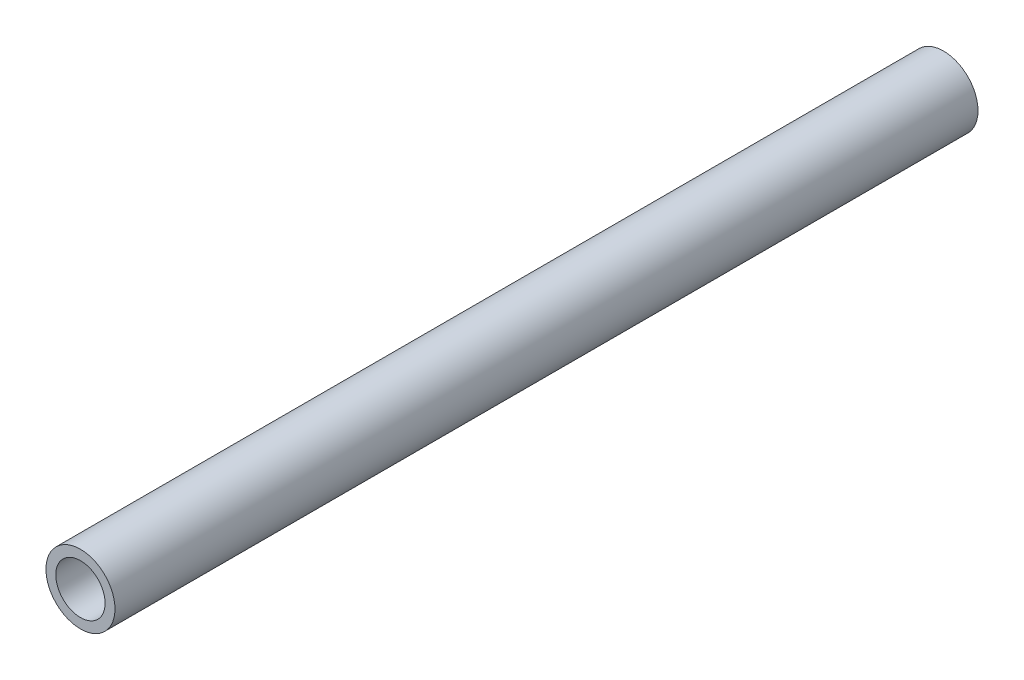
ISO-10303-21;
HEADER;
FILE_DESCRIPTION(('STEP AP214'),'2;1');
FILE_NAME('part.step','',(''),(''),'','','');
FILE_SCHEMA(('AUTOMOTIVE_DESIGN { 1 0 10303 214 1 1 1 1 }'));
ENDSEC;
DATA;
#1=APPLICATION_CONTEXT('core data for automotive mechanical design processes');
#2=APPLICATION_PROTOCOL_DEFINITION('international standard','automotive_design',2000,#1);
#3=PRODUCT_CONTEXT('',#1,'mechanical');
#4=PRODUCT('Part','Part','',(#3));
#5=PRODUCT_RELATED_PRODUCT_CATEGORY('part','',(#4));
#6=PRODUCT_DEFINITION_FORMATION('','',#4);
#7=PRODUCT_DEFINITION_CONTEXT('part definition',#1,'design');
#8=PRODUCT_DEFINITION('design','',#6,#7);
#9=PRODUCT_DEFINITION_SHAPE('','',#8);
#10=(LENGTH_UNIT() NAMED_UNIT(*) SI_UNIT(.MILLI.,.METRE.));
#11=(NAMED_UNIT(*) PLANE_ANGLE_UNIT() SI_UNIT($,.RADIAN.));
#12=(NAMED_UNIT(*) SI_UNIT($,.STERADIAN.) SOLID_ANGLE_UNIT());
#13=UNCERTAINTY_MEASURE_WITH_UNIT(LENGTH_MEASURE(1.E-05),#10,'distance_accuracy_value','');
#14=(GEOMETRIC_REPRESENTATION_CONTEXT(3) GLOBAL_UNCERTAINTY_ASSIGNED_CONTEXT((#13)) GLOBAL_UNIT_ASSIGNED_CONTEXT((#10,
#11,#12)) REPRESENTATION_CONTEXT('',''));
#15=CARTESIAN_POINT('',(0.,0.,0.));
#16=DIRECTION('',(0.,0.,1.));
#17=DIRECTION('',(1.,0.,0.));
#18=AXIS2_PLACEMENT_3D('',#15,#16,#17);
#19=CARTESIAN_POINT('',(0.,0.,175.));
#20=DIRECTION('',(0.,0.,1.));
#21=DIRECTION('',(1.,0.,0.));
#22=AXIS2_PLACEMENT_3D('',#19,#20,#21);
#23=PLANE('',#22);
#24=CARTESIAN_POINT('',(0.,0.,175.));
#25=DIRECTION('',(0.,0.,1.));
#26=DIRECTION('',(1.,0.,0.));
#27=AXIS2_PLACEMENT_3D('',#24,#25,#26);
#28=CIRCLE('',#27,7.);
#29=CARTESIAN_POINT('',(7.,0.,175.));
#30=VERTEX_POINT('',#29);
#31=EDGE_CURVE('E10',#30,#30,#28,.T.);
#32=ORIENTED_EDGE('',*,*,#31,.T.);
#33=EDGE_LOOP('',(#32));
#34=FACE_BOUND('',#33,.T.);
#35=CARTESIAN_POINT('',(0.,0.,175.));
#36=DIRECTION('',(0.,0.,1.));
#37=DIRECTION('',(1.,0.,0.));
#38=AXIS2_PLACEMENT_3D('',#35,#36,#37);
#39=CIRCLE('',#38,5.);
#40=CARTESIAN_POINT('',(5.,0.,175.));
#41=VERTEX_POINT('',#40);
#42=EDGE_CURVE('E49',#41,#41,#39,.T.);
#43=ORIENTED_EDGE('',*,*,#42,.F.);
#44=EDGE_LOOP('',(#43));
#45=FACE_BOUND('',#44,.T.);
#46=ADVANCED_FACE('F38',(#34,#45),#23,.T.);
#47=CARTESIAN_POINT('',(0.,0.,0.));
#48=DIRECTION('',(0.,0.,1.));
#49=DIRECTION('',(1.,0.,0.));
#50=AXIS2_PLACEMENT_3D('',#47,#48,#49);
#51=PLANE('',#50);
#52=CARTESIAN_POINT('',(0.,0.,0.));
#53=DIRECTION('',(0.,0.,1.));
#54=DIRECTION('',(1.,0.,0.));
#55=AXIS2_PLACEMENT_3D('',#52,#53,#54);
#56=CIRCLE('',#55,7.);
#57=CARTESIAN_POINT('',(7.,0.,0.));
#58=VERTEX_POINT('',#57);
#59=EDGE_CURVE('E42',#58,#58,#56,.T.);
#60=ORIENTED_EDGE('',*,*,#59,.F.);
#61=EDGE_LOOP('',(#60));
#62=FACE_BOUND('',#61,.T.);
#63=CARTESIAN_POINT('',(0.,0.,0.));
#64=DIRECTION('',(0.,0.,1.));
#65=DIRECTION('',(1.,0.,0.));
#66=AXIS2_PLACEMENT_3D('',#63,#64,#65);
#67=CIRCLE('',#66,5.);
#68=CARTESIAN_POINT('',(5.,0.,0.));
#69=VERTEX_POINT('',#68);
#70=EDGE_CURVE('E51',#69,#69,#67,.T.);
#71=ORIENTED_EDGE('',*,*,#70,.T.);
#72=EDGE_LOOP('',(#71));
#73=FACE_BOUND('',#72,.T.);
#74=ADVANCED_FACE('F61',(#62,#73),#51,.F.);
#75=CARTESIAN_POINT('',(0.,0.,175.));
#76=DIRECTION('',(0.,0.,-1.));
#77=DIRECTION('',(-1.,0.,0.));
#78=AXIS2_PLACEMENT_3D('',#75,#76,#77);
#79=CYLINDRICAL_SURFACE('',#78,7.);
#80=ORIENTED_EDGE('',*,*,#31,.F.);
#81=EDGE_LOOP('',(#80));
#82=FACE_BOUND('',#81,.T.);
#83=ORIENTED_EDGE('',*,*,#59,.T.);
#84=EDGE_LOOP('',(#83));
#85=FACE_BOUND('',#84,.T.);
#86=ADVANCED_FACE('F40',(#82,#85),#79,.T.);
#87=CARTESIAN_POINT('',(0.,0.,175.));
#88=DIRECTION('',(0.,0.,-1.));
#89=DIRECTION('',(-1.,0.,0.));
#90=AXIS2_PLACEMENT_3D('',#87,#88,#89);
#91=CYLINDRICAL_SURFACE('',#90,5.);
#92=ORIENTED_EDGE('',*,*,#42,.T.);
#93=EDGE_LOOP('',(#92));
#94=FACE_BOUND('',#93,.T.);
#95=ORIENTED_EDGE('',*,*,#70,.F.);
#96=EDGE_LOOP('',(#95));
#97=FACE_BOUND('',#96,.T.);
#98=ADVANCED_FACE('F57',(#94,#97),#91,.F.);
#99=CLOSED_SHELL('',(#46,#74,#86,#98));
#100=MANIFOLD_SOLID_BREP('B2',#99);
#101=ADVANCED_BREP_SHAPE_REPRESENTATION('',(#18,#100),#14);
#102=SHAPE_DEFINITION_REPRESENTATION(#9,#101);
ENDSEC;
END-ISO-10303-21;
